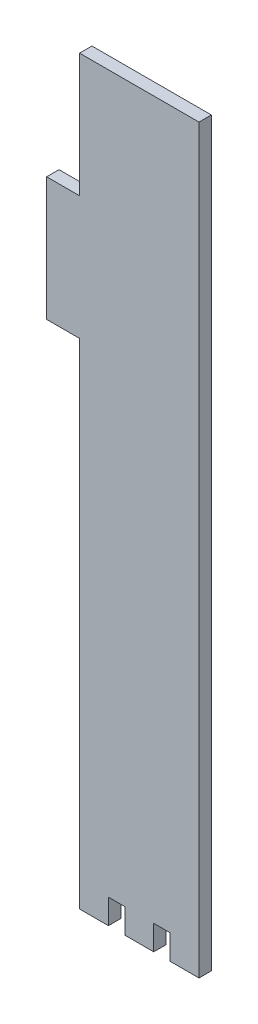
ISO-10303-21;
HEADER;
FILE_DESCRIPTION(('STEP AP214'),'2;1');
FILE_NAME('part.step','',(''),(''),'','','');
FILE_SCHEMA(('AUTOMOTIVE_DESIGN { 1 0 10303 214 1 1 1 1 }'));
ENDSEC;
DATA;
#1=APPLICATION_CONTEXT('core data for automotive mechanical design processes');
#2=APPLICATION_PROTOCOL_DEFINITION('international standard','automotive_design',2000,#1);
#3=PRODUCT_CONTEXT('',#1,'mechanical');
#4=PRODUCT('Part','Part','',(#3));
#5=PRODUCT_RELATED_PRODUCT_CATEGORY('part','',(#4));
#6=PRODUCT_DEFINITION_FORMATION('','',#4);
#7=PRODUCT_DEFINITION_CONTEXT('part definition',#1,'design');
#8=PRODUCT_DEFINITION('design','',#6,#7);
#9=PRODUCT_DEFINITION_SHAPE('','',#8);
#10=(LENGTH_UNIT() NAMED_UNIT(*) SI_UNIT(.MILLI.,.METRE.));
#11=(NAMED_UNIT(*) PLANE_ANGLE_UNIT() SI_UNIT($,.RADIAN.));
#12=(NAMED_UNIT(*) SI_UNIT($,.STERADIAN.) SOLID_ANGLE_UNIT());
#13=UNCERTAINTY_MEASURE_WITH_UNIT(LENGTH_MEASURE(1.E-05),#10,'distance_accuracy_value','');
#14=(GEOMETRIC_REPRESENTATION_CONTEXT(3) GLOBAL_UNCERTAINTY_ASSIGNED_CONTEXT((#13)) GLOBAL_UNIT_ASSIGNED_CONTEXT((#10,
#11,#12)) REPRESENTATION_CONTEXT('',''));
#15=CARTESIAN_POINT('',(0.,0.,0.));
#16=DIRECTION('',(0.,0.,1.));
#17=DIRECTION('',(1.,0.,0.));
#18=AXIS2_PLACEMENT_3D('',#15,#16,#17);
#19=CARTESIAN_POINT('',(0.,150.,3.));
#20=DIRECTION('',(0.,-1.,0.));
#21=DIRECTION('',(0.,0.,-1.));
#22=AXIS2_PLACEMENT_3D('',#19,#20,#21);
#23=PLANE('',#22);
#24=DIRECTION('',(-1.,0.,0.));
#25=VECTOR('',#24,1.);
#26=CARTESIAN_POINT('',(0.,150.,0.));
#27=LINE('',#26,#25);
#28=CARTESIAN_POINT('',(-29.,150.,0.));
#29=VERTEX_POINT('',#28);
#30=CARTESIAN_POINT('',(-37.,150.,0.));
#31=VERTEX_POINT('',#30);
#32=EDGE_CURVE('E183',#29,#31,#27,.T.);
#33=ORIENTED_EDGE('',*,*,#32,.T.);
#34=DIRECTION('',(0.,0.,-1.));
#35=VECTOR('',#34,1.);
#36=CARTESIAN_POINT('',(-37.,150.,3.));
#37=LINE('',#36,#35);
#38=CARTESIAN_POINT('',(-37.,150.,3.));
#39=VERTEX_POINT('',#38);
#40=EDGE_CURVE('E11',#39,#31,#37,.T.);
#41=ORIENTED_EDGE('',*,*,#40,.F.);
#42=DIRECTION('',(-1.,0.,0.));
#43=VECTOR('',#42,1.);
#44=CARTESIAN_POINT('',(0.,150.,3.));
#45=LINE('',#44,#43);
#46=CARTESIAN_POINT('',(-29.,150.,3.));
#47=VERTEX_POINT('',#46);
#48=EDGE_CURVE('E266',#47,#39,#45,.T.);
#49=ORIENTED_EDGE('',*,*,#48,.F.);
#50=DIRECTION('',(0.,0.,-1.));
#51=VECTOR('',#50,1.);
#52=CARTESIAN_POINT('',(-29.,150.,3.));
#53=LINE('',#52,#51);
#54=EDGE_CURVE('E53',#47,#29,#53,.T.);
#55=ORIENTED_EDGE('',*,*,#54,.T.);
#56=EDGE_LOOP('',(#33,#41,#49,#55));
#57=FACE_BOUND('',#56,.T.);
#58=ADVANCED_FACE('F37',(#57),#23,.F.);
#59=CARTESIAN_POINT('',(-37.,0.,3.));
#60=DIRECTION('',(1.,0.,0.));
#61=DIRECTION('',(0.,0.,-1.));
#62=AXIS2_PLACEMENT_3D('',#59,#60,#61);
#63=PLANE('',#62);
#64=DIRECTION('',(0.,-1.,0.));
#65=VECTOR('',#64,1.);
#66=CARTESIAN_POINT('',(-37.,0.,0.));
#67=LINE('',#66,#65);
#68=CARTESIAN_POINT('',(-37.,120.,0.));
#69=VERTEX_POINT('',#68);
#70=EDGE_CURVE('E185',#31,#69,#67,.T.);
#71=ORIENTED_EDGE('',*,*,#70,.T.);
#72=DIRECTION('',(0.,0.,-1.));
#73=VECTOR('',#72,1.);
#74=CARTESIAN_POINT('',(-37.,120.,3.));
#75=LINE('',#74,#73);
#76=CARTESIAN_POINT('',(-37.,120.,3.));
#77=VERTEX_POINT('',#76);
#78=EDGE_CURVE('E45',#77,#69,#75,.T.);
#79=ORIENTED_EDGE('',*,*,#78,.F.);
#80=DIRECTION('',(0.,-1.,0.));
#81=VECTOR('',#80,1.);
#82=CARTESIAN_POINT('',(-37.,0.,3.));
#83=LINE('',#82,#81);
#84=EDGE_CURVE('E116',#39,#77,#83,.T.);
#85=ORIENTED_EDGE('',*,*,#84,.F.);
#86=ORIENTED_EDGE('',*,*,#40,.T.);
#87=EDGE_LOOP('',(#71,#79,#85,#86));
#88=FACE_BOUND('',#87,.T.);
#89=ADVANCED_FACE('F251',(#88),#63,.F.);
#90=CARTESIAN_POINT('',(0.,120.,3.));
#91=DIRECTION('',(0.,-1.,0.));
#92=DIRECTION('',(0.,0.,-1.));
#93=AXIS2_PLACEMENT_3D('',#90,#91,#92);
#94=PLANE('',#93);
#95=DIRECTION('',(-1.,0.,0.));
#96=VECTOR('',#95,1.);
#97=CARTESIAN_POINT('',(0.,120.,0.));
#98=LINE('',#97,#96);
#99=CARTESIAN_POINT('',(-29.,120.,0.));
#100=VERTEX_POINT('',#99);
#101=EDGE_CURVE('E188',#100,#69,#98,.T.);
#102=ORIENTED_EDGE('',*,*,#101,.F.);
#103=DIRECTION('',(0.,0.,-1.));
#104=VECTOR('',#103,1.);
#105=CARTESIAN_POINT('',(-29.,120.,3.));
#106=LINE('',#105,#104);
#107=CARTESIAN_POINT('',(-29.,120.,3.));
#108=VERTEX_POINT('',#107);
#109=EDGE_CURVE('E244',#108,#100,#106,.T.);
#110=ORIENTED_EDGE('',*,*,#109,.F.);
#111=DIRECTION('',(-1.,0.,0.));
#112=VECTOR('',#111,1.);
#113=CARTESIAN_POINT('',(0.,120.,3.));
#114=LINE('',#113,#112);
#115=EDGE_CURVE('E250',#108,#77,#114,.T.);
#116=ORIENTED_EDGE('',*,*,#115,.T.);
#117=ORIENTED_EDGE('',*,*,#78,.T.);
#118=EDGE_LOOP('',(#102,#110,#116,#117));
#119=FACE_BOUND('',#118,.T.);
#120=ADVANCED_FACE('F248',(#119),#94,.T.);
#121=CARTESIAN_POINT('',(-29.,0.,3.));
#122=DIRECTION('',(-1.,0.,0.));
#123=DIRECTION('',(0.,-1.,0.));
#124=AXIS2_PLACEMENT_3D('',#121,#122,#123);
#125=PLANE('',#124);
#126=DIRECTION('',(0.,1.,0.));
#127=VECTOR('',#126,1.);
#128=CARTESIAN_POINT('',(-29.,0.,0.));
#129=LINE('',#128,#127);
#130=CARTESIAN_POINT('',(-29.,0.,0.));
#131=VERTEX_POINT('',#130);
#132=EDGE_CURVE('E191',#131,#100,#129,.T.);
#133=ORIENTED_EDGE('',*,*,#132,.F.);
#134=DIRECTION('',(0.,0.,-1.));
#135=VECTOR('',#134,1.);
#136=CARTESIAN_POINT('',(-29.,0.,3.));
#137=LINE('',#136,#135);
#138=CARTESIAN_POINT('',(-29.,0.,3.));
#139=VERTEX_POINT('',#138);
#140=EDGE_CURVE('E242',#139,#131,#137,.T.);
#141=ORIENTED_EDGE('',*,*,#140,.F.);
#142=DIRECTION('',(0.,1.,0.));
#143=VECTOR('',#142,1.);
#144=CARTESIAN_POINT('',(-29.,0.,3.));
#145=LINE('',#144,#143);
#146=EDGE_CURVE('E180',#139,#108,#145,.T.);
#147=ORIENTED_EDGE('',*,*,#146,.T.);
#148=ORIENTED_EDGE('',*,*,#109,.T.);
#149=EDGE_LOOP('',(#133,#141,#147,#148));
#150=FACE_BOUND('',#149,.T.);
#151=ADVANCED_FACE('F259',(#150),#125,.T.);
#152=CARTESIAN_POINT('',(0.,0.,3.));
#153=DIRECTION('',(0.,-1.,0.));
#154=DIRECTION('',(1.,0.,0.));
#155=AXIS2_PLACEMENT_3D('',#152,#153,#154);
#156=PLANE('',#155);
#157=DIRECTION('',(-1.,0.,0.));
#158=VECTOR('',#157,1.);
#159=CARTESIAN_POINT('',(0.,0.,0.));
#160=LINE('',#159,#158);
#161=CARTESIAN_POINT('',(-22.,0.,0.));
#162=VERTEX_POINT('',#161);
#163=EDGE_CURVE('E194',#162,#131,#160,.T.);
#164=ORIENTED_EDGE('',*,*,#163,.F.);
#165=DIRECTION('',(0.,0.,-1.));
#166=VECTOR('',#165,1.);
#167=CARTESIAN_POINT('',(-22.,0.,3.));
#168=LINE('',#167,#166);
#169=CARTESIAN_POINT('',(-22.,0.,3.));
#170=VERTEX_POINT('',#169);
#171=EDGE_CURVE('E240',#170,#162,#168,.T.);
#172=ORIENTED_EDGE('',*,*,#171,.F.);
#173=DIRECTION('',(-1.,0.,0.));
#174=VECTOR('',#173,1.);
#175=CARTESIAN_POINT('',(0.,0.,3.));
#176=LINE('',#175,#174);
#177=EDGE_CURVE('E265',#170,#139,#176,.T.);
#178=ORIENTED_EDGE('',*,*,#177,.T.);
#179=ORIENTED_EDGE('',*,*,#140,.T.);
#180=EDGE_LOOP('',(#164,#172,#178,#179));
#181=FACE_BOUND('',#180,.T.);
#182=ADVANCED_FACE('F301',(#181),#156,.T.);
#183=CARTESIAN_POINT('',(-22.,0.,3.));
#184=DIRECTION('',(-1.,0.,0.));
#185=DIRECTION('',(0.,-1.,0.));
#186=AXIS2_PLACEMENT_3D('',#183,#184,#185);
#187=PLANE('',#186);
#188=DIRECTION('',(0.,1.,0.));
#189=VECTOR('',#188,1.);
#190=CARTESIAN_POINT('',(-22.,0.,0.));
#191=LINE('',#190,#189);
#192=CARTESIAN_POINT('',(-22.,5.99999999999999,0.));
#193=VERTEX_POINT('',#192);
#194=EDGE_CURVE('E198',#162,#193,#191,.T.);
#195=ORIENTED_EDGE('',*,*,#194,.T.);
#196=DIRECTION('',(0.,0.,-1.));
#197=VECTOR('',#196,1.);
#198=CARTESIAN_POINT('',(-22.,5.99999999999999,3.));
#199=LINE('',#198,#197);
#200=CARTESIAN_POINT('',(-22.,5.99999999999999,3.));
#201=VERTEX_POINT('',#200);
#202=EDGE_CURVE('E238',#201,#193,#199,.T.);
#203=ORIENTED_EDGE('',*,*,#202,.F.);
#204=DIRECTION('',(0.,1.,0.));
#205=VECTOR('',#204,1.);
#206=CARTESIAN_POINT('',(-22.,0.,3.));
#207=LINE('',#206,#205);
#208=EDGE_CURVE('E271',#170,#201,#207,.T.);
#209=ORIENTED_EDGE('',*,*,#208,.F.);
#210=ORIENTED_EDGE('',*,*,#171,.T.);
#211=EDGE_LOOP('',(#195,#203,#209,#210));
#212=FACE_BOUND('',#211,.T.);
#213=ADVANCED_FACE('F304',(#212),#187,.F.);
#214=CARTESIAN_POINT('',(0.,6.,3.));
#215=DIRECTION('',(0.,-1.,0.));
#216=DIRECTION('',(1.,0.,0.));
#217=AXIS2_PLACEMENT_3D('',#214,#215,#216);
#218=PLANE('',#217);
#219=DIRECTION('',(-1.,0.,0.));
#220=VECTOR('',#219,1.);
#221=CARTESIAN_POINT('',(0.,6.,0.));
#222=LINE('',#221,#220);
#223=CARTESIAN_POINT('',(-18.,5.99999999999999,0.));
#224=VERTEX_POINT('',#223);
#225=EDGE_CURVE('E201',#224,#193,#222,.T.);
#226=ORIENTED_EDGE('',*,*,#225,.F.);
#227=DIRECTION('',(0.,0.,-1.));
#228=VECTOR('',#227,1.);
#229=CARTESIAN_POINT('',(-18.,5.99999999999999,3.));
#230=LINE('',#229,#228);
#231=CARTESIAN_POINT('',(-18.,5.99999999999999,3.));
#232=VERTEX_POINT('',#231);
#233=EDGE_CURVE('E236',#232,#224,#230,.T.);
#234=ORIENTED_EDGE('',*,*,#233,.F.);
#235=DIRECTION('',(-1.,0.,0.));
#236=VECTOR('',#235,1.);
#237=CARTESIAN_POINT('',(0.,6.,3.));
#238=LINE('',#237,#236);
#239=EDGE_CURVE('E273',#232,#201,#238,.T.);
#240=ORIENTED_EDGE('',*,*,#239,.T.);
#241=ORIENTED_EDGE('',*,*,#202,.T.);
#242=EDGE_LOOP('',(#226,#234,#240,#241));
#243=FACE_BOUND('',#242,.T.);
#244=ADVANCED_FACE('F308',(#243),#218,.T.);
#245=CARTESIAN_POINT('',(-18.,0.,3.));
#246=DIRECTION('',(1.,0.,0.));
#247=DIRECTION('',(0.,0.,-1.));
#248=AXIS2_PLACEMENT_3D('',#245,#246,#247);
#249=PLANE('',#248);
#250=DIRECTION('',(0.,-1.,0.));
#251=VECTOR('',#250,1.);
#252=CARTESIAN_POINT('',(-18.,0.,0.));
#253=LINE('',#252,#251);
#254=CARTESIAN_POINT('',(-18.,0.,0.));
#255=VERTEX_POINT('',#254);
#256=EDGE_CURVE('E204',#224,#255,#253,.T.);
#257=ORIENTED_EDGE('',*,*,#256,.T.);
#258=DIRECTION('',(0.,0.,-1.));
#259=VECTOR('',#258,1.);
#260=CARTESIAN_POINT('',(-18.,0.,3.));
#261=LINE('',#260,#259);
#262=CARTESIAN_POINT('',(-18.,0.,3.));
#263=VERTEX_POINT('',#262);
#264=EDGE_CURVE('E234',#263,#255,#261,.T.);
#265=ORIENTED_EDGE('',*,*,#264,.F.);
#266=DIRECTION('',(0.,-1.,0.));
#267=VECTOR('',#266,1.);
#268=CARTESIAN_POINT('',(-18.,0.,3.));
#269=LINE('',#268,#267);
#270=EDGE_CURVE('E276',#232,#263,#269,.T.);
#271=ORIENTED_EDGE('',*,*,#270,.F.);
#272=ORIENTED_EDGE('',*,*,#233,.T.);
#273=EDGE_LOOP('',(#257,#265,#271,#272));
#274=FACE_BOUND('',#273,.T.);
#275=ADVANCED_FACE('F310',(#274),#249,.F.);
#276=CARTESIAN_POINT('',(0.,0.,3.));
#277=DIRECTION('',(0.,-1.,0.));
#278=DIRECTION('',(1.,0.,0.));
#279=AXIS2_PLACEMENT_3D('',#276,#277,#278);
#280=PLANE('',#279);
#281=DIRECTION('',(-1.,0.,0.));
#282=VECTOR('',#281,1.);
#283=CARTESIAN_POINT('',(0.,0.,0.));
#284=LINE('',#283,#282);
#285=CARTESIAN_POINT('',(-11.,0.,0.));
#286=VERTEX_POINT('',#285);
#287=EDGE_CURVE('E208',#286,#255,#284,.T.);
#288=ORIENTED_EDGE('',*,*,#287,.F.);
#289=DIRECTION('',(0.,0.,-1.));
#290=VECTOR('',#289,1.);
#291=CARTESIAN_POINT('',(-11.,0.,3.));
#292=LINE('',#291,#290);
#293=CARTESIAN_POINT('',(-11.,0.,3.));
#294=VERTEX_POINT('',#293);
#295=EDGE_CURVE('E232',#294,#286,#292,.T.);
#296=ORIENTED_EDGE('',*,*,#295,.F.);
#297=DIRECTION('',(-1.,0.,0.));
#298=VECTOR('',#297,1.);
#299=CARTESIAN_POINT('',(0.,0.,3.));
#300=LINE('',#299,#298);
#301=EDGE_CURVE('E279',#294,#263,#300,.T.);
#302=ORIENTED_EDGE('',*,*,#301,.T.);
#303=ORIENTED_EDGE('',*,*,#264,.T.);
#304=EDGE_LOOP('',(#288,#296,#302,#303));
#305=FACE_BOUND('',#304,.T.);
#306=ADVANCED_FACE('F313',(#305),#280,.T.);
#307=CARTESIAN_POINT('',(-11.,0.,3.));
#308=DIRECTION('',(1.,0.,0.));
#309=DIRECTION('',(0.,0.,-1.));
#310=AXIS2_PLACEMENT_3D('',#307,#308,#309);
#311=PLANE('',#310);
#312=DIRECTION('',(0.,-1.,0.));
#313=VECTOR('',#312,1.);
#314=CARTESIAN_POINT('',(-11.,0.,0.));
#315=LINE('',#314,#313);
#316=CARTESIAN_POINT('',(-11.,6.,0.));
#317=VERTEX_POINT('',#316);
#318=EDGE_CURVE('E211',#317,#286,#315,.T.);
#319=ORIENTED_EDGE('',*,*,#318,.F.);
#320=DIRECTION('',(0.,0.,-1.));
#321=VECTOR('',#320,1.);
#322=CARTESIAN_POINT('',(-11.,6.,3.));
#323=LINE('',#322,#321);
#324=CARTESIAN_POINT('',(-11.,6.,3.));
#325=VERTEX_POINT('',#324);
#326=EDGE_CURVE('E230',#325,#317,#323,.T.);
#327=ORIENTED_EDGE('',*,*,#326,.F.);
#328=DIRECTION('',(0.,-1.,0.));
#329=VECTOR('',#328,1.);
#330=CARTESIAN_POINT('',(-11.,0.,3.));
#331=LINE('',#330,#329);
#332=EDGE_CURVE('E282',#325,#294,#331,.T.);
#333=ORIENTED_EDGE('',*,*,#332,.T.);
#334=ORIENTED_EDGE('',*,*,#295,.T.);
#335=EDGE_LOOP('',(#319,#327,#333,#334));
#336=FACE_BOUND('',#335,.T.);
#337=ADVANCED_FACE('F317',(#336),#311,.T.);
#338=CARTESIAN_POINT('',(-7.,6.,0.));
#339=VERTEX_POINT('',#338);
#340=EDGE_CURVE('E205',#339,#317,#222,.T.);
#341=ORIENTED_EDGE('',*,*,#340,.F.);
#342=DIRECTION('',(0.,0.,-1.));
#343=VECTOR('',#342,1.);
#344=CARTESIAN_POINT('',(-7.,6.,3.));
#345=LINE('',#344,#343);
#346=CARTESIAN_POINT('',(-7.,6.,3.));
#347=VERTEX_POINT('',#346);
#348=EDGE_CURVE('E228',#347,#339,#345,.T.);
#349=ORIENTED_EDGE('',*,*,#348,.F.);
#350=EDGE_CURVE('E277',#347,#325,#238,.T.);
#351=ORIENTED_EDGE('',*,*,#350,.T.);
#352=ORIENTED_EDGE('',*,*,#326,.T.);
#353=EDGE_LOOP('',(#341,#349,#351,#352));
#354=FACE_BOUND('',#353,.T.);
#355=ADVANCED_FACE('F321',(#354),#218,.T.);
#356=CARTESIAN_POINT('',(-7.,0.,3.));
#357=DIRECTION('',(-1.,0.,0.));
#358=DIRECTION('',(0.,-1.,0.));
#359=AXIS2_PLACEMENT_3D('',#356,#357,#358);
#360=PLANE('',#359);
#361=DIRECTION('',(0.,1.,0.));
#362=VECTOR('',#361,1.);
#363=CARTESIAN_POINT('',(-7.,0.,0.));
#364=LINE('',#363,#362);
#365=CARTESIAN_POINT('',(-7.,0.,0.));
#366=VERTEX_POINT('',#365);
#367=EDGE_CURVE('E214',#366,#339,#364,.T.);
#368=ORIENTED_EDGE('',*,*,#367,.F.);
#369=DIRECTION('',(0.,0.,-1.));
#370=VECTOR('',#369,1.);
#371=CARTESIAN_POINT('',(-7.,0.,3.));
#372=LINE('',#371,#370);
#373=CARTESIAN_POINT('',(-7.,0.,3.));
#374=VERTEX_POINT('',#373);
#375=EDGE_CURVE('E226',#374,#366,#372,.T.);
#376=ORIENTED_EDGE('',*,*,#375,.F.);
#377=DIRECTION('',(0.,1.,0.));
#378=VECTOR('',#377,1.);
#379=CARTESIAN_POINT('',(-7.,0.,3.));
#380=LINE('',#379,#378);
#381=EDGE_CURVE('E285',#374,#347,#380,.T.);
#382=ORIENTED_EDGE('',*,*,#381,.T.);
#383=ORIENTED_EDGE('',*,*,#348,.T.);
#384=EDGE_LOOP('',(#368,#376,#382,#383));
#385=FACE_BOUND('',#384,.T.);
#386=ADVANCED_FACE('F325',(#385),#360,.T.);
#387=CARTESIAN_POINT('',(0.,0.,3.));
#388=DIRECTION('',(0.,-1.,0.));
#389=DIRECTION('',(1.,0.,0.));
#390=AXIS2_PLACEMENT_3D('',#387,#388,#389);
#391=PLANE('',#390);
#392=DIRECTION('',(-1.,0.,0.));
#393=VECTOR('',#392,1.);
#394=CARTESIAN_POINT('',(0.,0.,0.));
#395=LINE('',#394,#393);
#396=CARTESIAN_POINT('',(0.,0.,0.));
#397=VERTEX_POINT('',#396);
#398=EDGE_CURVE('E217',#397,#366,#395,.T.);
#399=ORIENTED_EDGE('',*,*,#398,.F.);
#400=DIRECTION('',(0.,0.,-1.));
#401=VECTOR('',#400,1.);
#402=CARTESIAN_POINT('',(0.,0.,3.));
#403=LINE('',#402,#401);
#404=CARTESIAN_POINT('',(0.,0.,3.));
#405=VERTEX_POINT('',#404);
#406=EDGE_CURVE('E174',#405,#397,#403,.T.);
#407=ORIENTED_EDGE('',*,*,#406,.F.);
#408=DIRECTION('',(-1.,0.,0.));
#409=VECTOR('',#408,1.);
#410=CARTESIAN_POINT('',(0.,0.,3.));
#411=LINE('',#410,#409);
#412=EDGE_CURVE('E164',#405,#374,#411,.T.);
#413=ORIENTED_EDGE('',*,*,#412,.T.);
#414=ORIENTED_EDGE('',*,*,#375,.T.);
#415=EDGE_LOOP('',(#399,#407,#413,#414));
#416=FACE_BOUND('',#415,.T.);
#417=ADVANCED_FACE('F289',(#416),#391,.T.);
#418=CARTESIAN_POINT('',(0.,0.,3.));
#419=DIRECTION('',(-1.,0.,0.));
#420=DIRECTION('',(0.,0.,1.));
#421=AXIS2_PLACEMENT_3D('',#418,#419,#420);
#422=PLANE('',#421);
#423=DIRECTION('',(0.,1.,0.));
#424=VECTOR('',#423,1.);
#425=CARTESIAN_POINT('',(0.,0.,0.));
#426=LINE('',#425,#424);
#427=CARTESIAN_POINT('',(0.,180.,0.));
#428=VERTEX_POINT('',#427);
#429=EDGE_CURVE('E171',#397,#428,#426,.T.);
#430=ORIENTED_EDGE('',*,*,#429,.T.);
#431=DIRECTION('',(0.,0.,-1.));
#432=VECTOR('',#431,1.);
#433=CARTESIAN_POINT('',(0.,180.,3.));
#434=LINE('',#433,#432);
#435=CARTESIAN_POINT('',(0.,180.,3.));
#436=VERTEX_POINT('',#435);
#437=EDGE_CURVE('E168',#436,#428,#434,.T.);
#438=ORIENTED_EDGE('',*,*,#437,.F.);
#439=DIRECTION('',(0.,1.,0.));
#440=VECTOR('',#439,1.);
#441=CARTESIAN_POINT('',(0.,0.,3.));
#442=LINE('',#441,#440);
#443=EDGE_CURVE('E156',#405,#436,#442,.T.);
#444=ORIENTED_EDGE('',*,*,#443,.F.);
#445=ORIENTED_EDGE('',*,*,#406,.T.);
#446=EDGE_LOOP('',(#430,#438,#444,#445));
#447=FACE_BOUND('',#446,.T.);
#448=ADVANCED_FACE('F169',(#447),#422,.F.);
#449=CARTESIAN_POINT('',(0.,180.,3.));
#450=DIRECTION('',(0.,-1.,0.));
#451=DIRECTION('',(0.,0.,-1.));
#452=AXIS2_PLACEMENT_3D('',#449,#450,#451);
#453=PLANE('',#452);
#454=DIRECTION('',(-1.,0.,0.));
#455=VECTOR('',#454,1.);
#456=CARTESIAN_POINT('',(0.,180.,0.));
#457=LINE('',#456,#455);
#458=CARTESIAN_POINT('',(-29.,180.,0.));
#459=VERTEX_POINT('',#458);
#460=EDGE_CURVE('E221',#428,#459,#457,.T.);
#461=ORIENTED_EDGE('',*,*,#460,.T.);
#462=DIRECTION('',(0.,0.,-1.));
#463=VECTOR('',#462,1.);
#464=CARTESIAN_POINT('',(-29.,180.,3.));
#465=LINE('',#464,#463);
#466=CARTESIAN_POINT('',(-29.,180.,3.));
#467=VERTEX_POINT('',#466);
#468=EDGE_CURVE('E104',#467,#459,#465,.T.);
#469=ORIENTED_EDGE('',*,*,#468,.F.);
#470=DIRECTION('',(-1.,0.,0.));
#471=VECTOR('',#470,1.);
#472=CARTESIAN_POINT('',(0.,180.,3.));
#473=LINE('',#472,#471);
#474=EDGE_CURVE('E161',#436,#467,#473,.T.);
#475=ORIENTED_EDGE('',*,*,#474,.F.);
#476=ORIENTED_EDGE('',*,*,#437,.T.);
#477=EDGE_LOOP('',(#461,#469,#475,#476));
#478=FACE_BOUND('',#477,.T.);
#479=ADVANCED_FACE('F176',(#478),#453,.F.);
#480=EDGE_CURVE('E195',#29,#459,#129,.T.);
#481=ORIENTED_EDGE('',*,*,#480,.F.);
#482=ORIENTED_EDGE('',*,*,#54,.F.);
#483=EDGE_CURVE('E177',#47,#467,#145,.T.);
#484=ORIENTED_EDGE('',*,*,#483,.T.);
#485=ORIENTED_EDGE('',*,*,#468,.T.);
#486=EDGE_LOOP('',(#481,#482,#484,#485));
#487=FACE_BOUND('',#486,.T.);
#488=ADVANCED_FACE('F336',(#487),#125,.T.);
#489=CARTESIAN_POINT('',(0.,0.,3.));
#490=DIRECTION('',(0.,0.,1.));
#491=DIRECTION('',(1.,0.,0.));
#492=AXIS2_PLACEMENT_3D('',#489,#490,#491);
#493=PLANE('',#492);
#494=ORIENTED_EDGE('',*,*,#48,.T.);
#495=ORIENTED_EDGE('',*,*,#84,.T.);
#496=ORIENTED_EDGE('',*,*,#115,.F.);
#497=ORIENTED_EDGE('',*,*,#146,.F.);
#498=ORIENTED_EDGE('',*,*,#177,.F.);
#499=ORIENTED_EDGE('',*,*,#208,.T.);
#500=ORIENTED_EDGE('',*,*,#239,.F.);
#501=ORIENTED_EDGE('',*,*,#270,.T.);
#502=ORIENTED_EDGE('',*,*,#301,.F.);
#503=ORIENTED_EDGE('',*,*,#332,.F.);
#504=ORIENTED_EDGE('',*,*,#350,.F.);
#505=ORIENTED_EDGE('',*,*,#381,.F.);
#506=ORIENTED_EDGE('',*,*,#412,.F.);
#507=ORIENTED_EDGE('',*,*,#443,.T.);
#508=ORIENTED_EDGE('',*,*,#474,.T.);
#509=ORIENTED_EDGE('',*,*,#483,.F.);
#510=EDGE_LOOP('',(#494,#495,#496,#497,#498,#499,#500,#501,#502,#503,#504,#505,#506,#507,#508,#509));
#511=FACE_BOUND('',#510,.T.);
#512=ADVANCED_FACE('F158',(#511),#493,.T.);
#513=CARTESIAN_POINT('',(0.,0.,0.));
#514=DIRECTION('',(0.,0.,1.));
#515=DIRECTION('',(1.,0.,0.));
#516=AXIS2_PLACEMENT_3D('',#513,#514,#515);
#517=PLANE('',#516);
#518=ORIENTED_EDGE('',*,*,#32,.F.);
#519=ORIENTED_EDGE('',*,*,#480,.T.);
#520=ORIENTED_EDGE('',*,*,#460,.F.);
#521=ORIENTED_EDGE('',*,*,#429,.F.);
#522=ORIENTED_EDGE('',*,*,#398,.T.);
#523=ORIENTED_EDGE('',*,*,#367,.T.);
#524=ORIENTED_EDGE('',*,*,#340,.T.);
#525=ORIENTED_EDGE('',*,*,#318,.T.);
#526=ORIENTED_EDGE('',*,*,#287,.T.);
#527=ORIENTED_EDGE('',*,*,#256,.F.);
#528=ORIENTED_EDGE('',*,*,#225,.T.);
#529=ORIENTED_EDGE('',*,*,#194,.F.);
#530=ORIENTED_EDGE('',*,*,#163,.T.);
#531=ORIENTED_EDGE('',*,*,#132,.T.);
#532=ORIENTED_EDGE('',*,*,#101,.T.);
#533=ORIENTED_EDGE('',*,*,#70,.F.);
#534=EDGE_LOOP('',(#518,#519,#520,#521,#522,#523,#524,#525,#526,#527,#528,#529,#530,#531,#532,#533));
#535=FACE_BOUND('',#534,.T.);
#536=ADVANCED_FACE('F254',(#535),#517,.F.);
#537=CLOSED_SHELL('',(#58,#89,#120,#151,#182,#213,#244,#275,#306,#337,#355,#386,#417,#448,#479,
#488,#512,#536));
#538=MANIFOLD_SOLID_BREP('B2',#537);
#539=ADVANCED_BREP_SHAPE_REPRESENTATION('',(#18,#538),#14);
#540=SHAPE_DEFINITION_REPRESENTATION(#9,#539);
ENDSEC;
END-ISO-10303-21;
